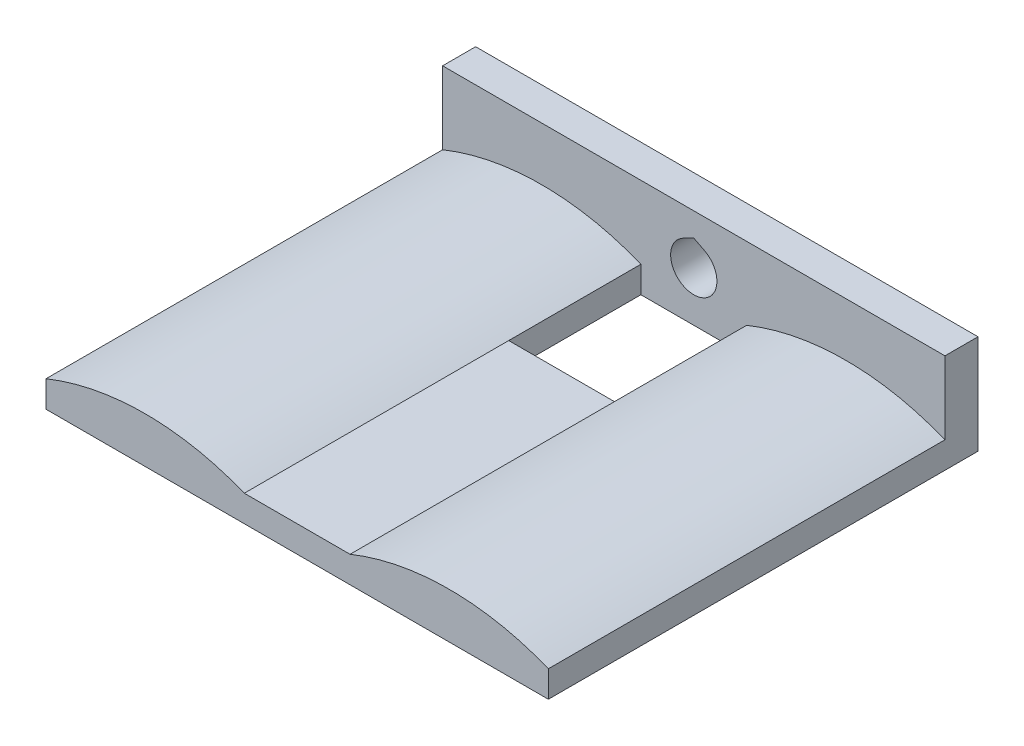
ISO-10303-21;
HEADER;
FILE_DESCRIPTION(('STEP AP214'),'2;1');
FILE_NAME('part.step','',(''),(''),'','','');
FILE_SCHEMA(('AUTOMOTIVE_DESIGN { 1 0 10303 214 1 1 1 1 }'));
ENDSEC;
DATA;
#1=APPLICATION_CONTEXT('core data for automotive mechanical design processes');
#2=APPLICATION_PROTOCOL_DEFINITION('international standard','automotive_design',2000,#1);
#3=PRODUCT_CONTEXT('',#1,'mechanical');
#4=PRODUCT('Part','Part','',(#3));
#5=PRODUCT_RELATED_PRODUCT_CATEGORY('part','',(#4));
#6=PRODUCT_DEFINITION_FORMATION('','',#4);
#7=PRODUCT_DEFINITION_CONTEXT('part definition',#1,'design');
#8=PRODUCT_DEFINITION('design','',#6,#7);
#9=PRODUCT_DEFINITION_SHAPE('','',#8);
#10=(LENGTH_UNIT() NAMED_UNIT(*) SI_UNIT(.MILLI.,.METRE.));
#11=(NAMED_UNIT(*) PLANE_ANGLE_UNIT() SI_UNIT($,.RADIAN.));
#12=(NAMED_UNIT(*) SI_UNIT($,.STERADIAN.) SOLID_ANGLE_UNIT());
#13=UNCERTAINTY_MEASURE_WITH_UNIT(LENGTH_MEASURE(1.E-05),#10,'distance_accuracy_value','');
#14=(GEOMETRIC_REPRESENTATION_CONTEXT(3) GLOBAL_UNCERTAINTY_ASSIGNED_CONTEXT((#13)) GLOBAL_UNIT_ASSIGNED_CONTEXT((#10,
#11,#12)) REPRESENTATION_CONTEXT('',''));
#15=CARTESIAN_POINT('',(0.,0.,0.));
#16=DIRECTION('',(0.,0.,1.));
#17=DIRECTION('',(1.,0.,0.));
#18=AXIS2_PLACEMENT_3D('',#15,#16,#17);
#19=CARTESIAN_POINT('',(-4.,-3.75,32.5));
#20=DIRECTION('',(-1.,0.,0.));
#21=DIRECTION('',(0.,0.,1.));
#22=AXIS2_PLACEMENT_3D('',#19,#20,#21);
#23=PLANE('',#22);
#24=DIRECTION('',(0.,-1.,0.));
#25=VECTOR('',#24,1.);
#26=CARTESIAN_POINT('',(-4.,-1.75,12.5));
#27=LINE('',#26,#25);
#28=CARTESIAN_POINT('',(-4.,-1.75,12.5));
#29=VERTEX_POINT('',#28);
#30=CARTESIAN_POINT('',(-4.,-3.75,12.5));
#31=VERTEX_POINT('',#30);
#32=EDGE_CURVE('E145',#29,#31,#27,.T.);
#33=ORIENTED_EDGE('',*,*,#32,.T.);
#34=DIRECTION('',(0.,0.,-1.));
#35=VECTOR('',#34,1.);
#36=CARTESIAN_POINT('',(-4.,-3.75,32.5));
#37=LINE('',#36,#35);
#38=CARTESIAN_POINT('',(-4.,-3.75,2.5));
#39=VERTEX_POINT('',#38);
#40=EDGE_CURVE('E153',#31,#39,#37,.T.);
#41=ORIENTED_EDGE('',*,*,#40,.T.);
#42=DIRECTION('',(0.,1.,0.));
#43=VECTOR('',#42,1.);
#44=CARTESIAN_POINT('',(-4.,-3.75,2.5));
#45=LINE('',#44,#43);
#46=CARTESIAN_POINT('',(-4.,-1.75,2.5));
#47=VERTEX_POINT('',#46);
#48=EDGE_CURVE('E258',#39,#47,#45,.T.);
#49=ORIENTED_EDGE('',*,*,#48,.T.);
#50=DIRECTION('',(0.,0.,-1.));
#51=VECTOR('',#50,1.);
#52=CARTESIAN_POINT('',(-4.,-1.75,32.5));
#53=LINE('',#52,#51);
#54=EDGE_CURVE('E155',#29,#47,#53,.T.);
#55=ORIENTED_EDGE('',*,*,#54,.F.);
#56=EDGE_LOOP('',(#33,#41,#49,#55));
#57=FACE_BOUND('',#56,.T.);
#58=ADVANCED_FACE('F43',(#57),#23,.F.);
#59=CARTESIAN_POINT('',(4.,-3.75,32.5));
#60=DIRECTION('',(-1.,0.,0.));
#61=DIRECTION('',(0.,0.,1.));
#62=AXIS2_PLACEMENT_3D('',#59,#60,#61);
#63=PLANE('',#62);
#64=DIRECTION('',(0.,0.,-1.));
#65=VECTOR('',#64,1.);
#66=CARTESIAN_POINT('',(4.,-3.75,32.5));
#67=LINE('',#66,#65);
#68=CARTESIAN_POINT('',(4.,-3.75,12.5));
#69=VERTEX_POINT('',#68);
#70=CARTESIAN_POINT('',(4.,-3.75,2.5));
#71=VERTEX_POINT('',#70);
#72=EDGE_CURVE('E63',#69,#71,#67,.T.);
#73=ORIENTED_EDGE('',*,*,#72,.F.);
#74=DIRECTION('',(0.,1.,0.));
#75=VECTOR('',#74,1.);
#76=CARTESIAN_POINT('',(4.,-3.75,12.5));
#77=LINE('',#76,#75);
#78=CARTESIAN_POINT('',(4.,-1.75,12.5));
#79=VERTEX_POINT('',#78);
#80=EDGE_CURVE('E58',#69,#79,#77,.T.);
#81=ORIENTED_EDGE('',*,*,#80,.T.);
#82=DIRECTION('',(0.,0.,-1.));
#83=VECTOR('',#82,1.);
#84=CARTESIAN_POINT('',(4.,-1.75,32.5));
#85=LINE('',#84,#83);
#86=CARTESIAN_POINT('',(4.,-1.75,2.5));
#87=VERTEX_POINT('',#86);
#88=EDGE_CURVE('E253',#79,#87,#85,.T.);
#89=ORIENTED_EDGE('',*,*,#88,.T.);
#90=DIRECTION('',(0.,1.,0.));
#91=VECTOR('',#90,1.);
#92=CARTESIAN_POINT('',(4.,-3.75,2.5));
#93=LINE('',#92,#91);
#94=EDGE_CURVE('E241',#71,#87,#93,.T.);
#95=ORIENTED_EDGE('',*,*,#94,.F.);
#96=EDGE_LOOP('',(#73,#81,#89,#95));
#97=FACE_BOUND('',#96,.T.);
#98=ADVANCED_FACE('F299',(#97),#63,.T.);
#99=CARTESIAN_POINT('',(0.,0.,2.5));
#100=DIRECTION('',(0.,0.,-1.));
#101=DIRECTION('',(-1.,0.,0.));
#102=AXIS2_PLACEMENT_3D('',#99,#100,#101);
#103=PLANE('',#102);
#104=DIRECTION('',(-0.892223711646202,-0.451593676191634,0.));
#105=VECTOR('',#104,1.);
#106=CARTESIAN_POINT('',(0.,1.96139149538085,2.5));
#107=LINE('',#106,#105);
#108=CARTESIAN_POINT('',(0.,1.96139149538085,2.5));
#109=VERTEX_POINT('',#108);
#110=CARTESIAN_POINT('',(-0.79028893333536,1.56139149538085,2.5));
#111=VERTEX_POINT('',#110);
#112=EDGE_CURVE('E173',#109,#111,#107,.T.);
#113=ORIENTED_EDGE('',*,*,#112,.F.);
#114=DIRECTION('',(-0.892223711646202,0.451593676191634,0.));
#115=VECTOR('',#114,1.);
#116=CARTESIAN_POINT('',(0.,1.96139149538085,2.5));
#117=LINE('',#116,#115);
#118=CARTESIAN_POINT('',(0.79028893333536,1.56139149538085,2.5));
#119=VERTEX_POINT('',#118);
#120=EDGE_CURVE('E179',#119,#109,#117,.T.);
#121=ORIENTED_EDGE('',*,*,#120,.F.);
#122=CARTESIAN_POINT('',(0.,0.,2.5));
#123=DIRECTION('',(0.,0.,1.));
#124=DIRECTION('',(1.,0.,0.));
#125=AXIS2_PLACEMENT_3D('',#122,#123,#124);
#126=CIRCLE('',#125,1.75);
#127=EDGE_CURVE('E175',#111,#119,#126,.T.);
#128=ORIENTED_EDGE('',*,*,#127,.F.);
#129=EDGE_LOOP('',(#113,#121,#128));
#130=FACE_BOUND('',#129,.T.);
#131=ORIENTED_EDGE('',*,*,#94,.T.);
#132=CARTESIAN_POINT('',(11.5,-20.2904962177392,2.5));
#133=DIRECTION('',(0.,0.,-1.));
#134=DIRECTION('',(1.,0.,0.));
#135=AXIS2_PLACEMENT_3D('',#132,#133,#134);
#136=CIRCLE('',#135,20.);
#137=CARTESIAN_POINT('',(19.,-1.75,2.5));
#138=VERTEX_POINT('',#137);
#139=EDGE_CURVE('E245',#87,#138,#136,.T.);
#140=ORIENTED_EDGE('',*,*,#139,.T.);
#141=DIRECTION('',(0.,1.,0.));
#142=VECTOR('',#141,1.);
#143=CARTESIAN_POINT('',(19.,-3.75,2.5));
#144=LINE('',#143,#142);
#145=CARTESIAN_POINT('',(19.,3.75,2.5));
#146=VERTEX_POINT('',#145);
#147=EDGE_CURVE('E194',#138,#146,#144,.T.);
#148=ORIENTED_EDGE('',*,*,#147,.T.);
#149=DIRECTION('',(-1.,0.,0.));
#150=VECTOR('',#149,1.);
#151=CARTESIAN_POINT('',(-19.,3.75,2.5));
#152=LINE('',#151,#150);
#153=CARTESIAN_POINT('',(-19.,3.75,2.5));
#154=VERTEX_POINT('',#153);
#155=EDGE_CURVE('E196',#146,#154,#152,.T.);
#156=ORIENTED_EDGE('',*,*,#155,.T.);
#157=DIRECTION('',(0.,-1.,0.));
#158=VECTOR('',#157,1.);
#159=CARTESIAN_POINT('',(-19.,-3.75,2.5));
#160=LINE('',#159,#158);
#161=CARTESIAN_POINT('',(-19.,-1.75,2.5));
#162=VERTEX_POINT('',#161);
#163=EDGE_CURVE('E199',#154,#162,#160,.T.);
#164=ORIENTED_EDGE('',*,*,#163,.T.);
#165=CARTESIAN_POINT('',(-11.5,-20.2904962177392,2.5));
#166=DIRECTION('',(0.,0.,1.));
#167=DIRECTION('',(-1.,0.,0.));
#168=AXIS2_PLACEMENT_3D('',#165,#166,#167);
#169=CIRCLE('',#168,20.);
#170=EDGE_CURVE('E262',#47,#162,#169,.T.);
#171=ORIENTED_EDGE('',*,*,#170,.F.);
#172=ORIENTED_EDGE('',*,*,#48,.F.);
#173=DIRECTION('',(1.,0.,0.));
#174=VECTOR('',#173,1.);
#175=CARTESIAN_POINT('',(-19.,-3.75,2.5));
#176=LINE('',#175,#174);
#177=EDGE_CURVE('E163',#39,#71,#176,.T.);
#178=ORIENTED_EDGE('',*,*,#177,.T.);
#179=EDGE_LOOP('',(#131,#140,#148,#156,#164,#171,#172,#178));
#180=FACE_BOUND('',#179,.T.);
#181=ADVANCED_FACE('F278',(#130,#180),#103,.F.);
#182=CARTESIAN_POINT('',(0.,0.,0.));
#183=DIRECTION('',(0.,0.,-1.));
#184=DIRECTION('',(-1.,0.,0.));
#185=AXIS2_PLACEMENT_3D('',#182,#183,#184);
#186=PLANE('',#185);
#187=DIRECTION('',(0.,1.,0.));
#188=VECTOR('',#187,1.);
#189=CARTESIAN_POINT('',(19.,-3.75,0.));
#190=LINE('',#189,#188);
#191=CARTESIAN_POINT('',(19.,-3.75,0.));
#192=VERTEX_POINT('',#191);
#193=CARTESIAN_POINT('',(19.,3.75,0.));
#194=VERTEX_POINT('',#193);
#195=EDGE_CURVE('E193',#192,#194,#190,.T.);
#196=ORIENTED_EDGE('',*,*,#195,.F.);
#197=DIRECTION('',(1.,0.,0.));
#198=VECTOR('',#197,1.);
#199=CARTESIAN_POINT('',(-19.,-3.75,0.));
#200=LINE('',#199,#198);
#201=CARTESIAN_POINT('',(-19.,-3.75,0.));
#202=VERTEX_POINT('',#201);
#203=EDGE_CURVE('E197',#202,#192,#200,.T.);
#204=ORIENTED_EDGE('',*,*,#203,.F.);
#205=DIRECTION('',(0.,-1.,0.));
#206=VECTOR('',#205,1.);
#207=CARTESIAN_POINT('',(-19.,-3.75,0.));
#208=LINE('',#207,#206);
#209=CARTESIAN_POINT('',(-19.,3.75,0.));
#210=VERTEX_POINT('',#209);
#211=EDGE_CURVE('E207',#210,#202,#208,.T.);
#212=ORIENTED_EDGE('',*,*,#211,.F.);
#213=DIRECTION('',(-1.,0.,0.));
#214=VECTOR('',#213,1.);
#215=CARTESIAN_POINT('',(-19.,3.75,0.));
#216=LINE('',#215,#214);
#217=EDGE_CURVE('E205',#194,#210,#216,.T.);
#218=ORIENTED_EDGE('',*,*,#217,.F.);
#219=EDGE_LOOP('',(#196,#204,#212,#218));
#220=FACE_BOUND('',#219,.T.);
#221=DIRECTION('',(-0.892223711646202,0.451593676191634,0.));
#222=VECTOR('',#221,1.);
#223=CARTESIAN_POINT('',(0.,1.96139149538085,0.));
#224=LINE('',#223,#222);
#225=CARTESIAN_POINT('',(0.79028893333536,1.56139149538085,0.));
#226=VERTEX_POINT('',#225);
#227=CARTESIAN_POINT('',(0.,1.96139149538085,0.));
#228=VERTEX_POINT('',#227);
#229=EDGE_CURVE('E176',#226,#228,#224,.T.);
#230=ORIENTED_EDGE('',*,*,#229,.T.);
#231=DIRECTION('',(-0.892223711646202,-0.451593676191634,0.));
#232=VECTOR('',#231,1.);
#233=CARTESIAN_POINT('',(0.,1.96139149538085,0.));
#234=LINE('',#233,#232);
#235=CARTESIAN_POINT('',(-0.79028893333536,1.56139149538085,0.));
#236=VERTEX_POINT('',#235);
#237=EDGE_CURVE('E164',#228,#236,#234,.T.);
#238=ORIENTED_EDGE('',*,*,#237,.T.);
#239=CARTESIAN_POINT('',(0.,0.,0.));
#240=DIRECTION('',(0.,0.,1.));
#241=DIRECTION('',(1.,0.,0.));
#242=AXIS2_PLACEMENT_3D('',#239,#240,#241);
#243=CIRCLE('',#242,1.75);
#244=EDGE_CURVE('E168',#236,#226,#243,.T.);
#245=ORIENTED_EDGE('',*,*,#244,.T.);
#246=EDGE_LOOP('',(#230,#238,#245));
#247=FACE_BOUND('',#246,.T.);
#248=ADVANCED_FACE('F226',(#220,#247),#186,.T.);
#249=CARTESIAN_POINT('',(19.,-3.75,2.5));
#250=DIRECTION('',(-1.,0.,0.));
#251=DIRECTION('',(0.,0.,1.));
#252=AXIS2_PLACEMENT_3D('',#249,#250,#251);
#253=PLANE('',#252);
#254=ORIENTED_EDGE('',*,*,#195,.T.);
#255=DIRECTION('',(0.,0.,-1.));
#256=VECTOR('',#255,1.);
#257=CARTESIAN_POINT('',(19.,3.75,2.5));
#258=LINE('',#257,#256);
#259=EDGE_CURVE('E11',#146,#194,#258,.T.);
#260=ORIENTED_EDGE('',*,*,#259,.F.);
#261=ORIENTED_EDGE('',*,*,#147,.F.);
#262=DIRECTION('',(0.,0.,-1.));
#263=VECTOR('',#262,1.);
#264=CARTESIAN_POINT('',(19.,-1.75,32.5));
#265=LINE('',#264,#263);
#266=CARTESIAN_POINT('',(19.,-1.75,32.5));
#267=VERTEX_POINT('',#266);
#268=EDGE_CURVE('E237',#267,#138,#265,.T.);
#269=ORIENTED_EDGE('',*,*,#268,.F.);
#270=DIRECTION('',(0.,-1.,0.));
#271=VECTOR('',#270,1.);
#272=CARTESIAN_POINT('',(19.,-3.75,32.5));
#273=LINE('',#272,#271);
#274=CARTESIAN_POINT('',(19.,-3.75,32.5));
#275=VERTEX_POINT('',#274);
#276=EDGE_CURVE('E234',#267,#275,#273,.T.);
#277=ORIENTED_EDGE('',*,*,#276,.T.);
#278=DIRECTION('',(0.,0.,-1.));
#279=VECTOR('',#278,1.);
#280=CARTESIAN_POINT('',(19.,-3.75,2.5));
#281=LINE('',#280,#279);
#282=EDGE_CURVE('E202',#275,#192,#281,.T.);
#283=ORIENTED_EDGE('',*,*,#282,.T.);
#284=EDGE_LOOP('',(#254,#260,#261,#269,#277,#283));
#285=FACE_BOUND('',#284,.T.);
#286=ADVANCED_FACE('F45',(#285),#253,.F.);
#287=CARTESIAN_POINT('',(-19.,3.75,2.5));
#288=DIRECTION('',(0.,-1.,0.));
#289=DIRECTION('',(0.,0.,-1.));
#290=AXIS2_PLACEMENT_3D('',#287,#288,#289);
#291=PLANE('',#290);
#292=ORIENTED_EDGE('',*,*,#217,.T.);
#293=DIRECTION('',(0.,0.,-1.));
#294=VECTOR('',#293,1.);
#295=CARTESIAN_POINT('',(-19.,3.75,2.5));
#296=LINE('',#295,#294);
#297=EDGE_CURVE('E51',#154,#210,#296,.T.);
#298=ORIENTED_EDGE('',*,*,#297,.F.);
#299=ORIENTED_EDGE('',*,*,#155,.F.);
#300=ORIENTED_EDGE('',*,*,#259,.T.);
#301=EDGE_LOOP('',(#292,#298,#299,#300));
#302=FACE_BOUND('',#301,.T.);
#303=ADVANCED_FACE('F279',(#302),#291,.F.);
#304=CARTESIAN_POINT('',(-19.,-3.75,2.5));
#305=DIRECTION('',(1.,0.,0.));
#306=DIRECTION('',(0.,0.,-1.));
#307=AXIS2_PLACEMENT_3D('',#304,#305,#306);
#308=PLANE('',#307);
#309=ORIENTED_EDGE('',*,*,#211,.T.);
#310=DIRECTION('',(0.,0.,-1.));
#311=VECTOR('',#310,1.);
#312=CARTESIAN_POINT('',(-19.,-3.75,2.5));
#313=LINE('',#312,#311);
#314=CARTESIAN_POINT('',(-19.,-3.75,32.5));
#315=VERTEX_POINT('',#314);
#316=EDGE_CURVE('E212',#315,#202,#313,.T.);
#317=ORIENTED_EDGE('',*,*,#316,.F.);
#318=DIRECTION('',(0.,-1.,0.));
#319=VECTOR('',#318,1.);
#320=CARTESIAN_POINT('',(-19.,-3.75,32.5));
#321=LINE('',#320,#319);
#322=CARTESIAN_POINT('',(-19.,-1.75,32.5));
#323=VERTEX_POINT('',#322);
#324=EDGE_CURVE('E264',#323,#315,#321,.T.);
#325=ORIENTED_EDGE('',*,*,#324,.F.);
#326=DIRECTION('',(0.,0.,-1.));
#327=VECTOR('',#326,1.);
#328=CARTESIAN_POINT('',(-19.,-1.75,32.5));
#329=LINE('',#328,#327);
#330=EDGE_CURVE('E267',#323,#162,#329,.T.);
#331=ORIENTED_EDGE('',*,*,#330,.T.);
#332=ORIENTED_EDGE('',*,*,#163,.F.);
#333=ORIENTED_EDGE('',*,*,#297,.T.);
#334=EDGE_LOOP('',(#309,#317,#325,#331,#332,#333));
#335=FACE_BOUND('',#334,.T.);
#336=ADVANCED_FACE('F219',(#335),#308,.F.);
#337=CARTESIAN_POINT('',(-19.,-3.75,2.5));
#338=DIRECTION('',(0.,1.,0.));
#339=DIRECTION('',(0.,0.,1.));
#340=AXIS2_PLACEMENT_3D('',#337,#338,#339);
#341=PLANE('',#340);
#342=ORIENTED_EDGE('',*,*,#40,.F.);
#343=DIRECTION('',(1.,0.,0.));
#344=VECTOR('',#343,1.);
#345=CARTESIAN_POINT('',(-4.,-3.75,12.5));
#346=LINE('',#345,#344);
#347=EDGE_CURVE('E141',#31,#69,#346,.T.);
#348=ORIENTED_EDGE('',*,*,#347,.T.);
#349=ORIENTED_EDGE('',*,*,#72,.T.);
#350=ORIENTED_EDGE('',*,*,#177,.F.);
#351=EDGE_LOOP('',(#342,#348,#349,#350));
#352=FACE_BOUND('',#351,.T.);
#353=ORIENTED_EDGE('',*,*,#203,.T.);
#354=ORIENTED_EDGE('',*,*,#282,.F.);
#355=DIRECTION('',(1.,0.,0.));
#356=VECTOR('',#355,1.);
#357=CARTESIAN_POINT('',(-19.,-3.75,32.5));
#358=LINE('',#357,#356);
#359=EDGE_CURVE('E259',#315,#275,#358,.T.);
#360=ORIENTED_EDGE('',*,*,#359,.F.);
#361=ORIENTED_EDGE('',*,*,#316,.T.);
#362=EDGE_LOOP('',(#353,#354,#360,#361));
#363=FACE_BOUND('',#362,.T.);
#364=ADVANCED_FACE('F160',(#352,#363),#341,.F.);
#365=CARTESIAN_POINT('',(0.,1.96139149538085,2.5));
#366=DIRECTION('',(0.451593676191634,-0.892223711646202,0.));
#367=DIRECTION('',(0.892223711646202,0.451593676191634,0.));
#368=AXIS2_PLACEMENT_3D('',#365,#366,#367);
#369=PLANE('',#368);
#370=ORIENTED_EDGE('',*,*,#237,.F.);
#371=DIRECTION('',(0.,0.,-1.));
#372=VECTOR('',#371,1.);
#373=CARTESIAN_POINT('',(0.,1.96139149538085,2.5));
#374=LINE('',#373,#372);
#375=EDGE_CURVE('E180',#109,#228,#374,.T.);
#376=ORIENTED_EDGE('',*,*,#375,.F.);
#377=ORIENTED_EDGE('',*,*,#112,.T.);
#378=DIRECTION('',(0.,0.,-1.));
#379=VECTOR('',#378,1.);
#380=CARTESIAN_POINT('',(-0.79028893333536,1.56139149538085,2.5));
#381=LINE('',#380,#379);
#382=EDGE_CURVE('E190',#111,#236,#381,.T.);
#383=ORIENTED_EDGE('',*,*,#382,.T.);
#384=EDGE_LOOP('',(#370,#376,#377,#383));
#385=FACE_BOUND('',#384,.T.);
#386=ADVANCED_FACE('F315',(#385),#369,.T.);
#387=CARTESIAN_POINT('',(0.,0.,2.5));
#388=DIRECTION('',(0.,0.,-1.));
#389=DIRECTION('',(-1.,0.,0.));
#390=AXIS2_PLACEMENT_3D('',#387,#388,#389);
#391=CYLINDRICAL_SURFACE('',#390,1.75);
#392=ORIENTED_EDGE('',*,*,#244,.F.);
#393=ORIENTED_EDGE('',*,*,#382,.F.);
#394=ORIENTED_EDGE('',*,*,#127,.T.);
#395=DIRECTION('',(0.,0.,-1.));
#396=VECTOR('',#395,1.);
#397=CARTESIAN_POINT('',(0.79028893333536,1.56139149538085,2.5));
#398=LINE('',#397,#396);
#399=EDGE_CURVE('E188',#119,#226,#398,.T.);
#400=ORIENTED_EDGE('',*,*,#399,.T.);
#401=EDGE_LOOP('',(#392,#393,#394,#400));
#402=FACE_BOUND('',#401,.T.);
#403=ADVANCED_FACE('F311',(#402),#391,.F.);
#404=CARTESIAN_POINT('',(0.,1.96139149538085,2.5));
#405=DIRECTION('',(-0.451593676191634,-0.892223711646203,0.));
#406=DIRECTION('',(0.892223711646203,-0.451593676191634,0.));
#407=AXIS2_PLACEMENT_3D('',#404,#405,#406);
#408=PLANE('',#407);
#409=ORIENTED_EDGE('',*,*,#229,.F.);
#410=ORIENTED_EDGE('',*,*,#399,.F.);
#411=ORIENTED_EDGE('',*,*,#120,.T.);
#412=ORIENTED_EDGE('',*,*,#375,.T.);
#413=EDGE_LOOP('',(#409,#410,#411,#412));
#414=FACE_BOUND('',#413,.T.);
#415=ADVANCED_FACE('F308',(#414),#408,.T.);
#416=CARTESIAN_POINT('',(-11.5,-20.2904962177392,32.5));
#417=DIRECTION('',(0.,0.,-1.));
#418=DIRECTION('',(-1.,0.,0.));
#419=AXIS2_PLACEMENT_3D('',#416,#417,#418);
#420=CYLINDRICAL_SURFACE('',#419,20.);
#421=ORIENTED_EDGE('',*,*,#170,.T.);
#422=ORIENTED_EDGE('',*,*,#330,.F.);
#423=CARTESIAN_POINT('',(-11.5,-20.2904962177392,32.5));
#424=DIRECTION('',(0.,0.,1.));
#425=DIRECTION('',(-1.,0.,0.));
#426=AXIS2_PLACEMENT_3D('',#423,#424,#425);
#427=CIRCLE('',#426,20.);
#428=CARTESIAN_POINT('',(-4.,-1.75,32.5));
#429=VERTEX_POINT('',#428);
#430=EDGE_CURVE('E261',#429,#323,#427,.T.);
#431=ORIENTED_EDGE('',*,*,#430,.F.);
#432=EDGE_CURVE('E165',#429,#29,#53,.T.);
#433=ORIENTED_EDGE('',*,*,#432,.T.);
#434=ORIENTED_EDGE('',*,*,#54,.T.);
#435=EDGE_LOOP('',(#421,#422,#431,#433,#434));
#436=FACE_BOUND('',#435,.T.);
#437=ADVANCED_FACE('F274',(#436),#420,.T.);
#438=CARTESIAN_POINT('',(-11.5,-20.2904962177392,32.5));
#439=DIRECTION('',(0.,0.,-1.));
#440=DIRECTION('',(-1.,0.,0.));
#441=AXIS2_PLACEMENT_3D('',#438,#439,#440);
#442=PLANE('',#441);
#443=ORIENTED_EDGE('',*,*,#359,.T.);
#444=ORIENTED_EDGE('',*,*,#276,.F.);
#445=CARTESIAN_POINT('',(11.5,-20.2904962177392,32.5));
#446=DIRECTION('',(0.,0.,-1.));
#447=DIRECTION('',(1.,0.,0.));
#448=AXIS2_PLACEMENT_3D('',#445,#446,#447);
#449=CIRCLE('',#448,20.);
#450=CARTESIAN_POINT('',(4.,-1.75,32.5));
#451=VERTEX_POINT('',#450);
#452=EDGE_CURVE('E240',#451,#267,#449,.T.);
#453=ORIENTED_EDGE('',*,*,#452,.F.);
#454=DIRECTION('',(-1.,0.,0.));
#455=VECTOR('',#454,1.);
#456=CARTESIAN_POINT('',(4.,-1.75,32.5));
#457=LINE('',#456,#455);
#458=EDGE_CURVE('E157',#451,#429,#457,.T.);
#459=ORIENTED_EDGE('',*,*,#458,.T.);
#460=ORIENTED_EDGE('',*,*,#430,.T.);
#461=ORIENTED_EDGE('',*,*,#324,.T.);
#462=EDGE_LOOP('',(#443,#444,#453,#459,#460,#461));
#463=FACE_BOUND('',#462,.T.);
#464=ADVANCED_FACE('F285',(#463),#442,.F.);
#465=CARTESIAN_POINT('',(11.5,-20.2904962177392,32.5));
#466=DIRECTION('',(0.,0.,-1.));
#467=DIRECTION('',(-1.,0.,0.));
#468=AXIS2_PLACEMENT_3D('',#465,#466,#467);
#469=CYLINDRICAL_SURFACE('',#468,20.);
#470=ORIENTED_EDGE('',*,*,#139,.F.);
#471=ORIENTED_EDGE('',*,*,#88,.F.);
#472=EDGE_CURVE('E254',#451,#79,#85,.T.);
#473=ORIENTED_EDGE('',*,*,#472,.F.);
#474=ORIENTED_EDGE('',*,*,#452,.T.);
#475=ORIENTED_EDGE('',*,*,#268,.T.);
#476=EDGE_LOOP('',(#470,#471,#473,#474,#475));
#477=FACE_BOUND('',#476,.T.);
#478=ADVANCED_FACE('F282',(#477),#469,.T.);
#479=CARTESIAN_POINT('',(4.,-1.75,12.5));
#480=DIRECTION('',(0.,1.,0.));
#481=DIRECTION('',(0.,0.,1.));
#482=AXIS2_PLACEMENT_3D('',#479,#480,#481);
#483=PLANE('',#482);
#484=ORIENTED_EDGE('',*,*,#458,.F.);
#485=ORIENTED_EDGE('',*,*,#472,.T.);
#486=DIRECTION('',(-1.,0.,0.));
#487=VECTOR('',#486,1.);
#488=CARTESIAN_POINT('',(4.,-1.75,12.5));
#489=LINE('',#488,#487);
#490=EDGE_CURVE('E250',#79,#29,#489,.T.);
#491=ORIENTED_EDGE('',*,*,#490,.T.);
#492=ORIENTED_EDGE('',*,*,#432,.F.);
#493=EDGE_LOOP('',(#484,#485,#491,#492));
#494=FACE_BOUND('',#493,.T.);
#495=ADVANCED_FACE('F287',(#494),#483,.T.);
#496=CARTESIAN_POINT('',(0.,0.,12.5));
#497=DIRECTION('',(0.,0.,1.));
#498=DIRECTION('',(1.,0.,0.));
#499=AXIS2_PLACEMENT_3D('',#496,#497,#498);
#500=PLANE('',#499);
#501=ORIENTED_EDGE('',*,*,#32,.F.);
#502=ORIENTED_EDGE('',*,*,#490,.F.);
#503=ORIENTED_EDGE('',*,*,#80,.F.);
#504=ORIENTED_EDGE('',*,*,#347,.F.);
#505=EDGE_LOOP('',(#501,#502,#503,#504));
#506=FACE_BOUND('',#505,.T.);
#507=ADVANCED_FACE('F143',(#506),#500,.F.);
#508=CLOSED_SHELL('',(#58,#98,#181,#248,#286,#303,#336,#364,#386,#403,#415,#437,#464,#478,#495,#507));
#509=MANIFOLD_SOLID_BREP('B2',#508);
#510=ADVANCED_BREP_SHAPE_REPRESENTATION('',(#18,#509),#14);
#511=SHAPE_DEFINITION_REPRESENTATION(#9,#510);
ENDSEC;
END-ISO-10303-21;
